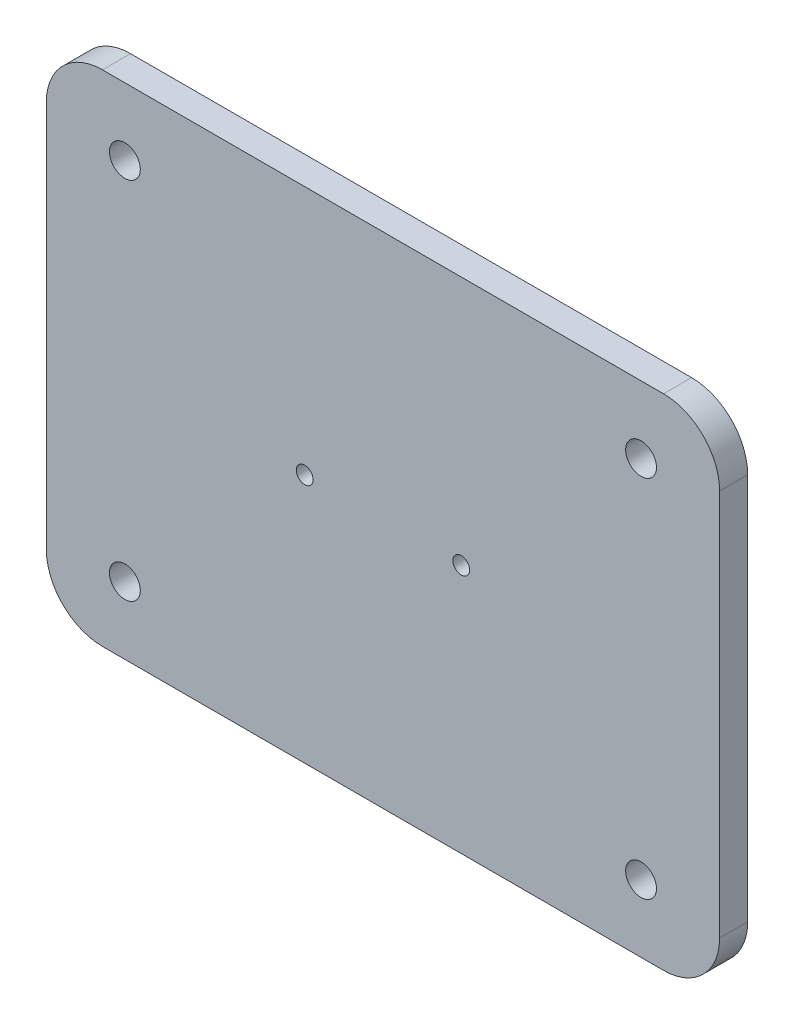
ISO-10303-21;
HEADER;
FILE_DESCRIPTION(('STEP AP214'),'2;1');
FILE_NAME('part.step','',(''),(''),'','','');
FILE_SCHEMA(('AUTOMOTIVE_DESIGN { 1 0 10303 214 1 1 1 1 }'));
ENDSEC;
DATA;
#1=APPLICATION_CONTEXT('core data for automotive mechanical design processes');
#2=APPLICATION_PROTOCOL_DEFINITION('international standard','automotive_design',2000,#1);
#3=PRODUCT_CONTEXT('',#1,'mechanical');
#4=PRODUCT('Part','Part','',(#3));
#5=PRODUCT_RELATED_PRODUCT_CATEGORY('part','',(#4));
#6=PRODUCT_DEFINITION_FORMATION('','',#4);
#7=PRODUCT_DEFINITION_CONTEXT('part definition',#1,'design');
#8=PRODUCT_DEFINITION('design','',#6,#7);
#9=PRODUCT_DEFINITION_SHAPE('','',#8);
#10=(LENGTH_UNIT() NAMED_UNIT(*) SI_UNIT(.MILLI.,.METRE.));
#11=(NAMED_UNIT(*) PLANE_ANGLE_UNIT() SI_UNIT($,.RADIAN.));
#12=(NAMED_UNIT(*) SI_UNIT($,.STERADIAN.) SOLID_ANGLE_UNIT());
#13=UNCERTAINTY_MEASURE_WITH_UNIT(LENGTH_MEASURE(1.E-05),#10,'distance_accuracy_value','');
#14=(GEOMETRIC_REPRESENTATION_CONTEXT(3) GLOBAL_UNCERTAINTY_ASSIGNED_CONTEXT((#13)) GLOBAL_UNIT_ASSIGNED_CONTEXT((#10,
#11,#12)) REPRESENTATION_CONTEXT('',''));
#15=CARTESIAN_POINT('',(0.,0.,0.));
#16=DIRECTION('',(0.,0.,1.));
#17=DIRECTION('',(1.,0.,0.));
#18=AXIS2_PLACEMENT_3D('',#15,#16,#17);
#19=CARTESIAN_POINT('',(0.,0.,5.));
#20=DIRECTION('',(0.,0.,1.));
#21=DIRECTION('',(1.,0.,0.));
#22=AXIS2_PLACEMENT_3D('',#19,#20,#21);
#23=PLANE('',#22);
#24=CARTESIAN_POINT('',(-9.51972176759412,-5.83387888707037,5.));
#25=DIRECTION('',(0.,0.,1.));
#26=DIRECTION('',(1.,0.,0.));
#27=AXIS2_PLACEMENT_3D('',#24,#25,#26);
#28=CIRCLE('',#27,1.5);
#29=CARTESIAN_POINT('',(-8.01972176759412,-5.83387888707037,5.));
#30=VERTEX_POINT('',#29);
#31=EDGE_CURVE('E388',#30,#30,#28,.T.);
#32=ORIENTED_EDGE('',*,*,#31,.F.);
#33=EDGE_LOOP('',(#32));
#34=FACE_BOUND('',#33,.T.);
#35=CARTESIAN_POINT('',(-37.4197217675941,-5.83387888707037,5.));
#36=DIRECTION('',(0.,0.,1.));
#37=DIRECTION('',(1.,0.,0.));
#38=AXIS2_PLACEMENT_3D('',#35,#36,#37);
#39=CIRCLE('',#38,1.5);
#40=CARTESIAN_POINT('',(-35.9197217675941,-5.83387888707037,5.));
#41=VERTEX_POINT('',#40);
#42=EDGE_CURVE('E393',#41,#41,#39,.T.);
#43=ORIENTED_EDGE('',*,*,#42,.F.);
#44=EDGE_LOOP('',(#43));
#45=FACE_BOUND('',#44,.T.);
#46=CARTESIAN_POINT('',(22.5302782324058,-38.3338788870703,5.));
#47=DIRECTION('',(0.,0.,1.));
#48=DIRECTION('',(1.,0.,0.));
#49=AXIS2_PLACEMENT_3D('',#46,#47,#48);
#50=CIRCLE('',#49,2.75000000000001);
#51=CARTESIAN_POINT('',(25.2802782324059,-38.3338788870703,5.));
#52=VERTEX_POINT('',#51);
#53=EDGE_CURVE('E414',#52,#52,#50,.F.);
#54=ORIENTED_EDGE('',*,*,#53,.T.);
#55=EDGE_LOOP('',(#54));
#56=FACE_BOUND('',#55,.T.);
#57=CARTESIAN_POINT('',(22.5302782324058,26.6661211129296,5.));
#58=DIRECTION('',(0.,0.,1.));
#59=DIRECTION('',(1.,0.,0.));
#60=AXIS2_PLACEMENT_3D('',#57,#58,#59);
#61=CIRCLE('',#60,2.75000000000001);
#62=CARTESIAN_POINT('',(25.2802782324059,26.6661211129296,5.));
#63=VERTEX_POINT('',#62);
#64=EDGE_CURVE('E229',#63,#63,#61,.F.);
#65=ORIENTED_EDGE('',*,*,#64,.T.);
#66=EDGE_LOOP('',(#65));
#67=FACE_BOUND('',#66,.T.);
#68=DIRECTION('',(-1.,0.,0.));
#69=VECTOR('',#68,1.);
#70=CARTESIAN_POINT('',(-83.4697217675941,38.6661211129296,5.));
#71=LINE('',#70,#69);
#72=CARTESIAN_POINT('',(26.5302782324059,38.6661211129296,5.));
#73=VERTEX_POINT('',#72);
#74=CARTESIAN_POINT('',(-73.4697217675941,38.6661211129296,5.));
#75=VERTEX_POINT('',#74);
#76=EDGE_CURVE('E177',#73,#75,#71,.T.);
#77=ORIENTED_EDGE('',*,*,#76,.T.);
#78=CARTESIAN_POINT('',(-73.4697217675941,28.6661211129296,5.));
#79=DIRECTION('',(0.,0.,1.));
#80=DIRECTION('',(1.,0.,0.));
#81=AXIS2_PLACEMENT_3D('',#78,#79,#80);
#82=CIRCLE('',#81,10.);
#83=CARTESIAN_POINT('',(-83.4697217675941,28.6661211129296,5.));
#84=VERTEX_POINT('',#83);
#85=EDGE_CURVE('E202',#75,#84,#82,.T.);
#86=ORIENTED_EDGE('',*,*,#85,.T.);
#87=DIRECTION('',(0.,-1.,0.));
#88=VECTOR('',#87,1.);
#89=CARTESIAN_POINT('',(-83.4697217675941,38.6661211129296,5.));
#90=LINE('',#89,#88);
#91=CARTESIAN_POINT('',(-83.4697217675941,-40.3338788870704,5.));
#92=VERTEX_POINT('',#91);
#93=EDGE_CURVE('E156',#84,#92,#90,.T.);
#94=ORIENTED_EDGE('',*,*,#93,.T.);
#95=CARTESIAN_POINT('',(-73.4697217675941,-40.3338788870704,5.));
#96=DIRECTION('',(0.,0.,1.));
#97=DIRECTION('',(1.,0.,0.));
#98=AXIS2_PLACEMENT_3D('',#95,#96,#97);
#99=CIRCLE('',#98,10.);
#100=CARTESIAN_POINT('',(-73.4697217675941,-50.3338788870704,5.));
#101=VERTEX_POINT('',#100);
#102=EDGE_CURVE('E92',#92,#101,#99,.T.);
#103=ORIENTED_EDGE('',*,*,#102,.T.);
#104=DIRECTION('',(1.,0.,0.));
#105=VECTOR('',#104,1.);
#106=CARTESIAN_POINT('',(-83.4697217675941,-50.3338788870704,5.));
#107=LINE('',#106,#105);
#108=CARTESIAN_POINT('',(26.5302782324059,-50.3338788870704,5.));
#109=VERTEX_POINT('',#108);
#110=EDGE_CURVE('E234',#101,#109,#107,.T.);
#111=ORIENTED_EDGE('',*,*,#110,.T.);
#112=CARTESIAN_POINT('',(26.5302782324059,-40.3338788870704,5.));
#113=DIRECTION('',(0.,0.,1.));
#114=DIRECTION('',(1.,0.,0.));
#115=AXIS2_PLACEMENT_3D('',#112,#113,#114);
#116=CIRCLE('',#115,10.);
#117=CARTESIAN_POINT('',(36.5302782324059,-40.3338788870704,5.));
#118=VERTEX_POINT('',#117);
#119=EDGE_CURVE('E84',#109,#118,#116,.T.);
#120=ORIENTED_EDGE('',*,*,#119,.T.);
#121=DIRECTION('',(0.,-1.,0.));
#122=VECTOR('',#121,1.);
#123=CARTESIAN_POINT('',(36.5302782324059,0.,5.));
#124=LINE('',#123,#122);
#125=CARTESIAN_POINT('',(36.5302782324059,28.6661211129296,5.));
#126=VERTEX_POINT('',#125);
#127=EDGE_CURVE('E174',#126,#118,#124,.T.);
#128=ORIENTED_EDGE('',*,*,#127,.F.);
#129=CARTESIAN_POINT('',(26.5302782324059,28.6661211129296,5.));
#130=DIRECTION('',(0.,0.,1.));
#131=DIRECTION('',(1.,0.,0.));
#132=AXIS2_PLACEMENT_3D('',#129,#130,#131);
#133=CIRCLE('',#132,10.);
#134=EDGE_CURVE('E195',#126,#73,#133,.T.);
#135=ORIENTED_EDGE('',*,*,#134,.T.);
#136=EDGE_LOOP('',(#77,#86,#94,#103,#111,#120,#128,#135));
#137=FACE_BOUND('',#136,.T.);
#138=CARTESIAN_POINT('',(-69.4697217675941,-38.3338788870704,5.));
#139=DIRECTION('',(0.,0.,1.));
#140=DIRECTION('',(1.,0.,0.));
#141=AXIS2_PLACEMENT_3D('',#138,#139,#140);
#142=CIRCLE('',#141,2.75000000000001);
#143=CARTESIAN_POINT('',(-66.7197217675941,-38.3338788870704,5.));
#144=VERTEX_POINT('',#143);
#145=EDGE_CURVE('E406',#144,#144,#142,.T.);
#146=ORIENTED_EDGE('',*,*,#145,.F.);
#147=EDGE_LOOP('',(#146));
#148=FACE_BOUND('',#147,.T.);
#149=CARTESIAN_POINT('',(-69.4697217675941,26.6661211129296,5.));
#150=DIRECTION('',(0.,0.,1.));
#151=DIRECTION('',(1.,0.,0.));
#152=AXIS2_PLACEMENT_3D('',#149,#150,#151);
#153=CIRCLE('',#152,2.75000000000001);
#154=CARTESIAN_POINT('',(-66.7197217675941,26.6661211129296,5.));
#155=VERTEX_POINT('',#154);
#156=EDGE_CURVE('E422',#155,#155,#153,.T.);
#157=ORIENTED_EDGE('',*,*,#156,.F.);
#158=EDGE_LOOP('',(#157));
#159=FACE_BOUND('',#158,.T.);
#160=ADVANCED_FACE('F68',(#34,#45,#56,#67,#137,#148,#159),#23,.T.);
#161=CARTESIAN_POINT('',(0.,0.,0.));
#162=DIRECTION('',(0.,0.,1.));
#163=DIRECTION('',(1.,0.,0.));
#164=AXIS2_PLACEMENT_3D('',#161,#162,#163);
#165=PLANE('',#164);
#166=CARTESIAN_POINT('',(-9.51972176759412,-5.83387888707037,0.));
#167=DIRECTION('',(0.,0.,-1.));
#168=DIRECTION('',(-1.,0.,0.));
#169=AXIS2_PLACEMENT_3D('',#166,#167,#168);
#170=CIRCLE('',#169,1.5);
#171=CARTESIAN_POINT('',(-11.0197217675941,-5.83387888707037,0.));
#172=VERTEX_POINT('',#171);
#173=EDGE_CURVE('E391',#172,#172,#170,.T.);
#174=ORIENTED_EDGE('',*,*,#173,.F.);
#175=EDGE_LOOP('',(#174));
#176=FACE_BOUND('',#175,.T.);
#177=CARTESIAN_POINT('',(-37.4197217675941,-5.83387888707037,0.));
#178=DIRECTION('',(0.,0.,-1.));
#179=DIRECTION('',(-1.,0.,0.));
#180=AXIS2_PLACEMENT_3D('',#177,#178,#179);
#181=CIRCLE('',#180,1.5);
#182=CARTESIAN_POINT('',(-38.9197217675941,-5.83387888707037,0.));
#183=VERTEX_POINT('',#182);
#184=EDGE_CURVE('E394',#183,#183,#181,.T.);
#185=ORIENTED_EDGE('',*,*,#184,.F.);
#186=EDGE_LOOP('',(#185));
#187=FACE_BOUND('',#186,.T.);
#188=CARTESIAN_POINT('',(-69.4697217675941,-38.3338788870704,0.));
#189=DIRECTION('',(0.,0.,1.));
#190=DIRECTION('',(1.,0.,0.));
#191=AXIS2_PLACEMENT_3D('',#188,#189,#190);
#192=CIRCLE('',#191,2.75000000000001);
#193=CARTESIAN_POINT('',(-66.7197217675941,-38.3338788870704,0.));
#194=VERTEX_POINT('',#193);
#195=EDGE_CURVE('E410',#194,#194,#192,.T.);
#196=ORIENTED_EDGE('',*,*,#195,.T.);
#197=EDGE_LOOP('',(#196));
#198=FACE_BOUND('',#197,.T.);
#199=CARTESIAN_POINT('',(22.5302782324058,26.6661211129296,0.));
#200=DIRECTION('',(0.,0.,1.));
#201=DIRECTION('',(1.,0.,0.));
#202=AXIS2_PLACEMENT_3D('',#199,#200,#201);
#203=CIRCLE('',#202,2.75000000000001);
#204=CARTESIAN_POINT('',(25.2802782324059,26.6661211129296,0.));
#205=VERTEX_POINT('',#204);
#206=EDGE_CURVE('E225',#205,#205,#203,.F.);
#207=ORIENTED_EDGE('',*,*,#206,.F.);
#208=EDGE_LOOP('',(#207));
#209=FACE_BOUND('',#208,.T.);
#210=DIRECTION('',(0.,-1.,0.));
#211=VECTOR('',#210,1.);
#212=CARTESIAN_POINT('',(-83.4697217675941,38.6661211129296,0.));
#213=LINE('',#212,#211);
#214=CARTESIAN_POINT('',(-83.4697217675941,28.6661211129296,0.));
#215=VERTEX_POINT('',#214);
#216=CARTESIAN_POINT('',(-83.4697217675941,-40.3338788870704,0.));
#217=VERTEX_POINT('',#216);
#218=EDGE_CURVE('E154',#215,#217,#213,.T.);
#219=ORIENTED_EDGE('',*,*,#218,.F.);
#220=CARTESIAN_POINT('',(-73.4697217675941,28.6661211129296,0.));
#221=DIRECTION('',(0.,0.,1.));
#222=DIRECTION('',(1.,0.,0.));
#223=AXIS2_PLACEMENT_3D('',#220,#221,#222);
#224=CIRCLE('',#223,10.);
#225=CARTESIAN_POINT('',(-73.4697217675941,38.6661211129296,0.));
#226=VERTEX_POINT('',#225);
#227=EDGE_CURVE('E136',#215,#226,#224,.F.);
#228=ORIENTED_EDGE('',*,*,#227,.T.);
#229=DIRECTION('',(-1.,0.,0.));
#230=VECTOR('',#229,1.);
#231=CARTESIAN_POINT('',(-83.4697217675941,38.6661211129296,0.));
#232=LINE('',#231,#230);
#233=CARTESIAN_POINT('',(26.5302782324059,38.6661211129296,0.));
#234=VERTEX_POINT('',#233);
#235=EDGE_CURVE('E171',#234,#226,#232,.T.);
#236=ORIENTED_EDGE('',*,*,#235,.F.);
#237=CARTESIAN_POINT('',(26.5302782324059,28.6661211129296,0.));
#238=DIRECTION('',(0.,0.,1.));
#239=DIRECTION('',(1.,0.,0.));
#240=AXIS2_PLACEMENT_3D('',#237,#238,#239);
#241=CIRCLE('',#240,10.);
#242=CARTESIAN_POINT('',(36.5302782324059,28.6661211129296,0.));
#243=VERTEX_POINT('',#242);
#244=EDGE_CURVE('E158',#234,#243,#241,.F.);
#245=ORIENTED_EDGE('',*,*,#244,.T.);
#246=DIRECTION('',(0.,-1.,0.));
#247=VECTOR('',#246,1.);
#248=CARTESIAN_POINT('',(36.5302782324059,0.,0.));
#249=LINE('',#248,#247);
#250=CARTESIAN_POINT('',(36.5302782324059,-40.3338788870704,0.));
#251=VERTEX_POINT('',#250);
#252=EDGE_CURVE('E166',#243,#251,#249,.T.);
#253=ORIENTED_EDGE('',*,*,#252,.T.);
#254=CARTESIAN_POINT('',(26.5302782324059,-40.3338788870704,0.));
#255=DIRECTION('',(0.,0.,1.));
#256=DIRECTION('',(1.,0.,0.));
#257=AXIS2_PLACEMENT_3D('',#254,#255,#256);
#258=CIRCLE('',#257,10.);
#259=CARTESIAN_POINT('',(26.5302782324059,-50.3338788870704,0.));
#260=VERTEX_POINT('',#259);
#261=EDGE_CURVE('E186',#251,#260,#258,.F.);
#262=ORIENTED_EDGE('',*,*,#261,.T.);
#263=DIRECTION('',(1.,0.,0.));
#264=VECTOR('',#263,1.);
#265=CARTESIAN_POINT('',(-83.4697217675941,-50.3338788870704,0.));
#266=LINE('',#265,#264);
#267=CARTESIAN_POINT('',(-73.4697217675941,-50.3338788870704,0.));
#268=VERTEX_POINT('',#267);
#269=EDGE_CURVE('E165',#268,#260,#266,.T.);
#270=ORIENTED_EDGE('',*,*,#269,.F.);
#271=CARTESIAN_POINT('',(-73.4697217675941,-40.3338788870704,0.));
#272=DIRECTION('',(0.,0.,1.));
#273=DIRECTION('',(1.,0.,0.));
#274=AXIS2_PLACEMENT_3D('',#271,#272,#273);
#275=CIRCLE('',#274,10.);
#276=EDGE_CURVE('E148',#268,#217,#275,.F.);
#277=ORIENTED_EDGE('',*,*,#276,.T.);
#278=EDGE_LOOP('',(#219,#228,#236,#245,#253,#262,#270,#277));
#279=FACE_BOUND('',#278,.T.);
#280=CARTESIAN_POINT('',(22.5302782324058,-38.3338788870703,0.));
#281=DIRECTION('',(0.,0.,1.));
#282=DIRECTION('',(1.,0.,0.));
#283=AXIS2_PLACEMENT_3D('',#280,#281,#282);
#284=CIRCLE('',#283,2.75000000000001);
#285=CARTESIAN_POINT('',(25.2802782324059,-38.3338788870703,0.));
#286=VERTEX_POINT('',#285);
#287=EDGE_CURVE('E418',#286,#286,#284,.F.);
#288=ORIENTED_EDGE('',*,*,#287,.F.);
#289=EDGE_LOOP('',(#288));
#290=FACE_BOUND('',#289,.T.);
#291=CARTESIAN_POINT('',(-69.4697217675941,26.6661211129296,0.));
#292=DIRECTION('',(0.,0.,1.));
#293=DIRECTION('',(1.,0.,0.));
#294=AXIS2_PLACEMENT_3D('',#291,#292,#293);
#295=CIRCLE('',#294,2.75000000000001);
#296=CARTESIAN_POINT('',(-66.7197217675941,26.6661211129296,0.));
#297=VERTEX_POINT('',#296);
#298=EDGE_CURVE('E405',#297,#297,#295,.T.);
#299=ORIENTED_EDGE('',*,*,#298,.T.);
#300=EDGE_LOOP('',(#299));
#301=FACE_BOUND('',#300,.T.);
#302=ADVANCED_FACE('F161',(#176,#187,#198,#209,#279,#290,#301),#165,.F.);
#303=CARTESIAN_POINT('',(-83.4697217675941,38.6661211129296,5.));
#304=DIRECTION('',(1.,0.,0.));
#305=DIRECTION('',(0.,0.,-1.));
#306=AXIS2_PLACEMENT_3D('',#303,#304,#305);
#307=PLANE('',#306);
#308=ORIENTED_EDGE('',*,*,#93,.F.);
#309=DIRECTION('',(0.,0.,-1.));
#310=VECTOR('',#309,1.);
#311=CARTESIAN_POINT('',(-83.4697217675941,28.6661211129296,5.));
#312=LINE('',#311,#310);
#313=EDGE_CURVE('E140',#84,#215,#312,.T.);
#314=ORIENTED_EDGE('',*,*,#313,.T.);
#315=ORIENTED_EDGE('',*,*,#218,.T.);
#316=DIRECTION('',(0.,0.,-1.));
#317=VECTOR('',#316,1.);
#318=CARTESIAN_POINT('',(-83.4697217675941,-40.3338788870704,5.));
#319=LINE('',#318,#317);
#320=EDGE_CURVE('E159',#217,#92,#319,.F.);
#321=ORIENTED_EDGE('',*,*,#320,.T.);
#322=EDGE_LOOP('',(#308,#314,#315,#321));
#323=FACE_BOUND('',#322,.T.);
#324=ADVANCED_FACE('F153',(#323),#307,.F.);
#325=CARTESIAN_POINT('',(-83.4697217675941,-50.3338788870704,5.));
#326=DIRECTION('',(0.,1.,0.));
#327=DIRECTION('',(0.,0.,1.));
#328=AXIS2_PLACEMENT_3D('',#325,#326,#327);
#329=PLANE('',#328);
#330=ORIENTED_EDGE('',*,*,#110,.F.);
#331=DIRECTION('',(0.,0.,-1.));
#332=VECTOR('',#331,1.);
#333=CARTESIAN_POINT('',(-73.4697217675941,-50.3338788870704,5.));
#334=LINE('',#333,#332);
#335=EDGE_CURVE('E208',#101,#268,#334,.T.);
#336=ORIENTED_EDGE('',*,*,#335,.T.);
#337=ORIENTED_EDGE('',*,*,#269,.T.);
#338=DIRECTION('',(0.,0.,1.));
#339=VECTOR('',#338,1.);
#340=CARTESIAN_POINT('',(26.5302782324059,-50.3338788870704,5.));
#341=LINE('',#340,#339);
#342=EDGE_CURVE('E205',#260,#109,#341,.T.);
#343=ORIENTED_EDGE('',*,*,#342,.T.);
#344=EDGE_LOOP('',(#330,#336,#337,#343));
#345=FACE_BOUND('',#344,.T.);
#346=ADVANCED_FACE('F243',(#345),#329,.F.);
#347=CARTESIAN_POINT('',(-83.4697217675941,38.6661211129296,5.));
#348=DIRECTION('',(0.,-1.,0.));
#349=DIRECTION('',(0.,0.,-1.));
#350=AXIS2_PLACEMENT_3D('',#347,#348,#349);
#351=PLANE('',#350);
#352=ORIENTED_EDGE('',*,*,#235,.T.);
#353=DIRECTION('',(0.,0.,-1.));
#354=VECTOR('',#353,1.);
#355=CARTESIAN_POINT('',(-73.4697217675941,38.6661211129296,5.));
#356=LINE('',#355,#354);
#357=EDGE_CURVE('E141',#226,#75,#356,.F.);
#358=ORIENTED_EDGE('',*,*,#357,.T.);
#359=ORIENTED_EDGE('',*,*,#76,.F.);
#360=DIRECTION('',(0.,0.,1.));
#361=VECTOR('',#360,1.);
#362=CARTESIAN_POINT('',(26.5302782324059,38.6661211129296,5.));
#363=LINE('',#362,#361);
#364=EDGE_CURVE('E147',#73,#234,#363,.F.);
#365=ORIENTED_EDGE('',*,*,#364,.T.);
#366=EDGE_LOOP('',(#352,#358,#359,#365));
#367=FACE_BOUND('',#366,.T.);
#368=ADVANCED_FACE('F239',(#367),#351,.F.);
#369=CARTESIAN_POINT('',(36.5302782324059,0.,0.));
#370=DIRECTION('',(-1.,0.,0.));
#371=DIRECTION('',(0.,-1.,0.));
#372=AXIS2_PLACEMENT_3D('',#369,#370,#371);
#373=PLANE('',#372);
#374=ORIENTED_EDGE('',*,*,#127,.T.);
#375=DIRECTION('',(0.,0.,1.));
#376=VECTOR('',#375,1.);
#377=CARTESIAN_POINT('',(36.5302782324059,-40.3338788870704,0.));
#378=LINE('',#377,#376);
#379=EDGE_CURVE('E12',#118,#251,#378,.F.);
#380=ORIENTED_EDGE('',*,*,#379,.T.);
#381=ORIENTED_EDGE('',*,*,#252,.F.);
#382=DIRECTION('',(0.,0.,1.));
#383=VECTOR('',#382,1.);
#384=CARTESIAN_POINT('',(36.5302782324059,28.6661211129296,0.));
#385=LINE('',#384,#383);
#386=EDGE_CURVE('E77',#243,#126,#385,.T.);
#387=ORIENTED_EDGE('',*,*,#386,.T.);
#388=EDGE_LOOP('',(#374,#380,#381,#387));
#389=FACE_BOUND('',#388,.T.);
#390=ADVANCED_FACE('F218',(#389),#373,.F.);
#391=CARTESIAN_POINT('',(22.5302782324058,26.6661211129296,0.));
#392=DIRECTION('',(0.,0.,1.));
#393=DIRECTION('',(1.,0.,0.));
#394=AXIS2_PLACEMENT_3D('',#391,#392,#393);
#395=CYLINDRICAL_SURFACE('',#394,2.75000000000001);
#396=ORIENTED_EDGE('',*,*,#64,.F.);
#397=EDGE_LOOP('',(#396));
#398=FACE_BOUND('',#397,.T.);
#399=ORIENTED_EDGE('',*,*,#206,.T.);
#400=EDGE_LOOP('',(#399));
#401=FACE_BOUND('',#400,.T.);
#402=ADVANCED_FACE('F292',(#398,#401),#395,.F.);
#403=CARTESIAN_POINT('',(-69.4697217675941,-38.3338788870704,0.));
#404=DIRECTION('',(0.,0.,1.));
#405=DIRECTION('',(1.,0.,0.));
#406=AXIS2_PLACEMENT_3D('',#403,#404,#405);
#407=CYLINDRICAL_SURFACE('',#406,2.75000000000001);
#408=ORIENTED_EDGE('',*,*,#195,.F.);
#409=EDGE_LOOP('',(#408));
#410=FACE_BOUND('',#409,.T.);
#411=ORIENTED_EDGE('',*,*,#145,.T.);
#412=EDGE_LOOP('',(#411));
#413=FACE_BOUND('',#412,.T.);
#414=ADVANCED_FACE('F299',(#410,#413),#407,.F.);
#415=CARTESIAN_POINT('',(22.5302782324058,-38.3338788870703,0.));
#416=DIRECTION('',(0.,0.,1.));
#417=DIRECTION('',(1.,0.,0.));
#418=AXIS2_PLACEMENT_3D('',#415,#416,#417);
#419=CYLINDRICAL_SURFACE('',#418,2.75000000000001);
#420=ORIENTED_EDGE('',*,*,#287,.T.);
#421=EDGE_LOOP('',(#420));
#422=FACE_BOUND('',#421,.T.);
#423=ORIENTED_EDGE('',*,*,#53,.F.);
#424=EDGE_LOOP('',(#423));
#425=FACE_BOUND('',#424,.T.);
#426=ADVANCED_FACE('F306',(#422,#425),#419,.F.);
#427=CARTESIAN_POINT('',(-69.4697217675941,26.6661211129296,0.));
#428=DIRECTION('',(0.,0.,1.));
#429=DIRECTION('',(1.,0.,0.));
#430=AXIS2_PLACEMENT_3D('',#427,#428,#429);
#431=CYLINDRICAL_SURFACE('',#430,2.75000000000001);
#432=ORIENTED_EDGE('',*,*,#156,.T.);
#433=EDGE_LOOP('',(#432));
#434=FACE_BOUND('',#433,.T.);
#435=ORIENTED_EDGE('',*,*,#298,.F.);
#436=EDGE_LOOP('',(#435));
#437=FACE_BOUND('',#436,.T.);
#438=ADVANCED_FACE('F253',(#434,#437),#431,.F.);
#439=CARTESIAN_POINT('',(-73.4697217675941,28.6661211129296,5.));
#440=DIRECTION('',(0.,0.,-1.));
#441=DIRECTION('',(-1.,0.,0.));
#442=AXIS2_PLACEMENT_3D('',#439,#440,#441);
#443=CYLINDRICAL_SURFACE('',#442,10.);
#444=ORIENTED_EDGE('',*,*,#85,.F.);
#445=ORIENTED_EDGE('',*,*,#357,.F.);
#446=ORIENTED_EDGE('',*,*,#227,.F.);
#447=ORIENTED_EDGE('',*,*,#313,.F.);
#448=EDGE_LOOP('',(#444,#445,#446,#447));
#449=FACE_BOUND('',#448,.T.);
#450=ADVANCED_FACE('F139',(#449),#443,.T.);
#451=CARTESIAN_POINT('',(-73.4697217675941,-40.3338788870704,5.));
#452=DIRECTION('',(0.,0.,-1.));
#453=DIRECTION('',(-1.,0.,0.));
#454=AXIS2_PLACEMENT_3D('',#451,#452,#453);
#455=CYLINDRICAL_SURFACE('',#454,10.);
#456=ORIENTED_EDGE('',*,*,#102,.F.);
#457=ORIENTED_EDGE('',*,*,#320,.F.);
#458=ORIENTED_EDGE('',*,*,#276,.F.);
#459=ORIENTED_EDGE('',*,*,#335,.F.);
#460=EDGE_LOOP('',(#456,#457,#458,#459));
#461=FACE_BOUND('',#460,.T.);
#462=ADVANCED_FACE('F246',(#461),#455,.T.);
#463=CARTESIAN_POINT('',(26.5302782324059,-40.3338788870704,5.));
#464=DIRECTION('',(0.,0.,1.));
#465=DIRECTION('',(1.,0.,0.));
#466=AXIS2_PLACEMENT_3D('',#463,#464,#465);
#467=CYLINDRICAL_SURFACE('',#466,10.);
#468=ORIENTED_EDGE('',*,*,#261,.F.);
#469=ORIENTED_EDGE('',*,*,#379,.F.);
#470=ORIENTED_EDGE('',*,*,#119,.F.);
#471=ORIENTED_EDGE('',*,*,#342,.F.);
#472=EDGE_LOOP('',(#468,#469,#470,#471));
#473=FACE_BOUND('',#472,.T.);
#474=ADVANCED_FACE('F241',(#473),#467,.T.);
#475=CARTESIAN_POINT('',(26.5302782324059,28.6661211129296,0.));
#476=DIRECTION('',(0.,0.,1.));
#477=DIRECTION('',(1.,0.,0.));
#478=AXIS2_PLACEMENT_3D('',#475,#476,#477);
#479=CYLINDRICAL_SURFACE('',#478,10.);
#480=ORIENTED_EDGE('',*,*,#244,.F.);
#481=ORIENTED_EDGE('',*,*,#364,.F.);
#482=ORIENTED_EDGE('',*,*,#134,.F.);
#483=ORIENTED_EDGE('',*,*,#386,.F.);
#484=EDGE_LOOP('',(#480,#481,#482,#483));
#485=FACE_BOUND('',#484,.T.);
#486=ADVANCED_FACE('F70',(#485),#479,.T.);
#487=CARTESIAN_POINT('',(-37.4197217675941,-5.83387888707037,10.));
#488=DIRECTION('',(0.,0.,-1.));
#489=DIRECTION('',(-1.,0.,0.));
#490=AXIS2_PLACEMENT_3D('',#487,#488,#489);
#491=CYLINDRICAL_SURFACE('',#490,1.5);
#492=ORIENTED_EDGE('',*,*,#42,.T.);
#493=EDGE_LOOP('',(#492));
#494=FACE_BOUND('',#493,.T.);
#495=ORIENTED_EDGE('',*,*,#184,.T.);
#496=EDGE_LOOP('',(#495));
#497=FACE_BOUND('',#496,.T.);
#498=ADVANCED_FACE('F345',(#494,#497),#491,.F.);
#499=CARTESIAN_POINT('',(-9.51972176759412,-5.83387888707037,10.));
#500=DIRECTION('',(0.,0.,-1.));
#501=DIRECTION('',(-1.,0.,0.));
#502=AXIS2_PLACEMENT_3D('',#499,#500,#501);
#503=CYLINDRICAL_SURFACE('',#502,1.5);
#504=ORIENTED_EDGE('',*,*,#31,.T.);
#505=EDGE_LOOP('',(#504));
#506=FACE_BOUND('',#505,.T.);
#507=ORIENTED_EDGE('',*,*,#173,.T.);
#508=EDGE_LOOP('',(#507));
#509=FACE_BOUND('',#508,.T.);
#510=ADVANCED_FACE('F364',(#506,#509),#503,.F.);
#511=CLOSED_SHELL('',(#160,#302,#324,#346,#368,#390,#402,#414,#426,#438,#450,#462,#474,#486,
#498,#510));
#512=MANIFOLD_SOLID_BREP('B2',#511);
#513=ADVANCED_BREP_SHAPE_REPRESENTATION('',(#18,#512),#14);
#514=SHAPE_DEFINITION_REPRESENTATION(#9,#513);
ENDSEC;
END-ISO-10303-21;
